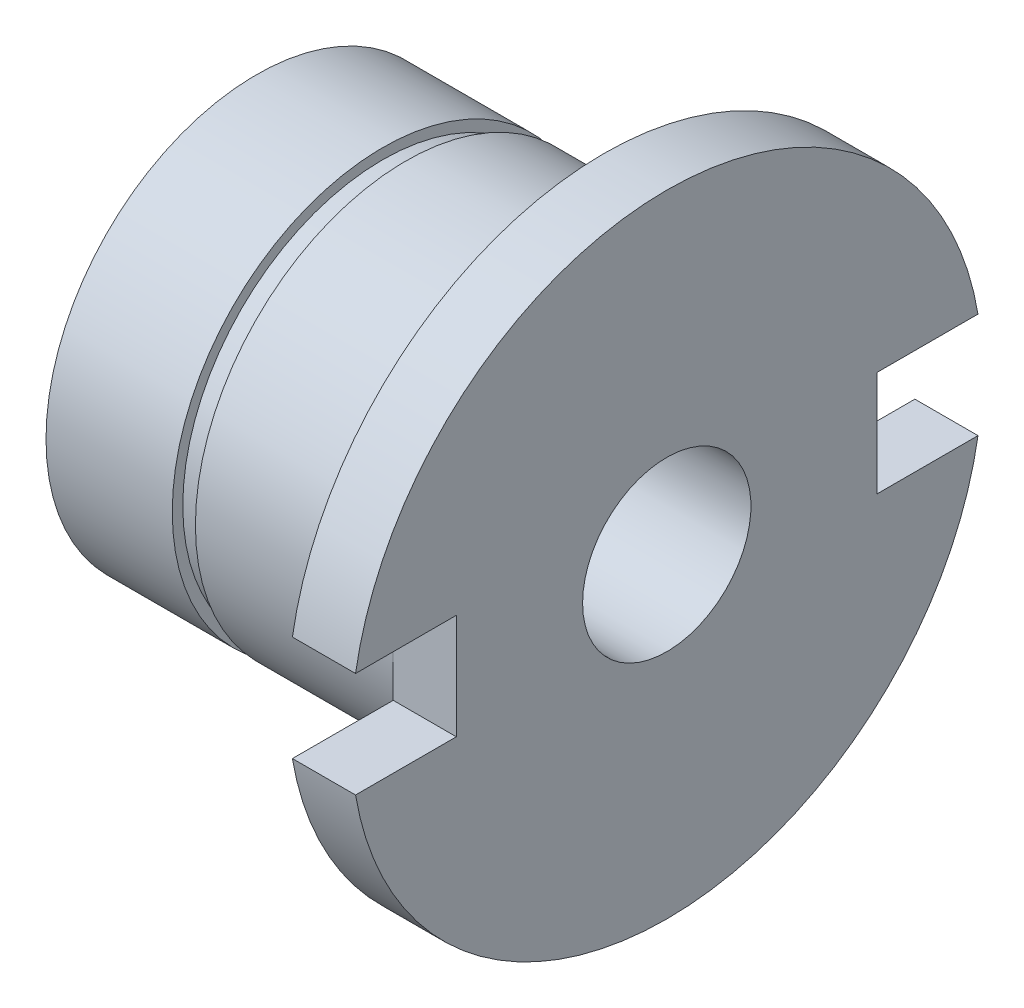
ISO-10303-21;
HEADER;
FILE_DESCRIPTION(('STEP AP214'),'2;1');
FILE_NAME('part.step','',(''),(''),'','','');
FILE_SCHEMA(('AUTOMOTIVE_DESIGN { 1 0 10303 214 1 1 1 1 }'));
ENDSEC;
DATA;
#1=APPLICATION_CONTEXT('core data for automotive mechanical design processes');
#2=APPLICATION_PROTOCOL_DEFINITION('international standard','automotive_design',2000,#1);
#3=PRODUCT_CONTEXT('',#1,'mechanical');
#4=PRODUCT('Part','Part','',(#3));
#5=PRODUCT_RELATED_PRODUCT_CATEGORY('part','',(#4));
#6=PRODUCT_DEFINITION_FORMATION('','',#4);
#7=PRODUCT_DEFINITION_CONTEXT('part definition',#1,'design');
#8=PRODUCT_DEFINITION('design','',#6,#7);
#9=PRODUCT_DEFINITION_SHAPE('','',#8);
#10=(LENGTH_UNIT() NAMED_UNIT(*) SI_UNIT(.MILLI.,.METRE.));
#11=(NAMED_UNIT(*) PLANE_ANGLE_UNIT() SI_UNIT($,.RADIAN.));
#12=(NAMED_UNIT(*) SI_UNIT($,.STERADIAN.) SOLID_ANGLE_UNIT());
#13=UNCERTAINTY_MEASURE_WITH_UNIT(LENGTH_MEASURE(1.E-05),#10,'distance_accuracy_value','');
#14=(GEOMETRIC_REPRESENTATION_CONTEXT(3) GLOBAL_UNCERTAINTY_ASSIGNED_CONTEXT((#13)) GLOBAL_UNIT_ASSIGNED_CONTEXT((#10,
#11,#12)) REPRESENTATION_CONTEXT('',''));
#15=CARTESIAN_POINT('',(0.,0.,0.));
#16=DIRECTION('',(0.,0.,1.));
#17=DIRECTION('',(1.,0.,0.));
#18=AXIS2_PLACEMENT_3D('',#15,#16,#17);
#19=CARTESIAN_POINT('',(0.,0.,0.));
#20=DIRECTION('',(-1.,0.,0.));
#21=DIRECTION('',(0.,0.,1.));
#22=AXIS2_PLACEMENT_3D('',#19,#20,#21);
#23=CYLINDRICAL_SURFACE('',#22,9.5);
#24=CARTESIAN_POINT('',(6.,0.,0.));
#25=DIRECTION('',(-1.,0.,0.));
#26=DIRECTION('',(0.,0.,1.));
#27=AXIS2_PLACEMENT_3D('',#24,#25,#26);
#28=CIRCLE('',#27,9.5);
#29=CARTESIAN_POINT('',(6.,0.,9.5));
#30=VERTEX_POINT('',#29);
#31=EDGE_CURVE('E20',#30,#30,#28,.F.);
#32=ORIENTED_EDGE('',*,*,#31,.T.);
#33=EDGE_LOOP('',(#32));
#34=FACE_BOUND('',#33,.T.);
#35=CARTESIAN_POINT('',(7.1,0.,0.));
#36=DIRECTION('',(-1.,0.,0.));
#37=DIRECTION('',(0.,0.,1.));
#38=AXIS2_PLACEMENT_3D('',#35,#36,#37);
#39=CIRCLE('',#38,9.5);
#40=CARTESIAN_POINT('',(7.1,0.,9.5));
#41=VERTEX_POINT('',#40);
#42=EDGE_CURVE('E205',#41,#41,#39,.T.);
#43=ORIENTED_EDGE('',*,*,#42,.T.);
#44=EDGE_LOOP('',(#43));
#45=FACE_BOUND('',#44,.T.);
#46=ADVANCED_FACE('F17',(#34,#45),#23,.T.);
#47=CARTESIAN_POINT('',(6.,9.5,0.));
#48=DIRECTION('',(-1.,0.,0.));
#49=DIRECTION('',(0.,0.,1.));
#50=AXIS2_PLACEMENT_3D('',#47,#48,#49);
#51=PLANE('',#50);
#52=ORIENTED_EDGE('',*,*,#31,.F.);
#53=EDGE_LOOP('',(#52));
#54=FACE_BOUND('',#53,.T.);
#55=CARTESIAN_POINT('',(6.,0.,0.));
#56=DIRECTION('',(-1.,0.,0.));
#57=DIRECTION('',(0.,0.,1.));
#58=AXIS2_PLACEMENT_3D('',#55,#56,#57);
#59=CIRCLE('',#58,10.);
#60=CARTESIAN_POINT('',(6.,0.,10.));
#61=VERTEX_POINT('',#60);
#62=EDGE_CURVE('E201',#61,#61,#59,.T.);
#63=ORIENTED_EDGE('',*,*,#62,.F.);
#64=EDGE_LOOP('',(#63));
#65=FACE_BOUND('',#64,.T.);
#66=ADVANCED_FACE('F188',(#54,#65),#51,.F.);
#67=CARTESIAN_POINT('',(7.1,10.,0.));
#68=DIRECTION('',(1.,0.,0.));
#69=DIRECTION('',(0.,0.,-1.));
#70=AXIS2_PLACEMENT_3D('',#67,#68,#69);
#71=PLANE('',#70);
#72=CARTESIAN_POINT('',(7.1,0.,0.));
#73=DIRECTION('',(-1.,0.,0.));
#74=DIRECTION('',(0.,0.,1.));
#75=AXIS2_PLACEMENT_3D('',#72,#73,#74);
#76=CIRCLE('',#75,10.);
#77=CARTESIAN_POINT('',(7.1,0.,10.));
#78=VERTEX_POINT('',#77);
#79=EDGE_CURVE('E204',#78,#78,#76,.F.);
#80=ORIENTED_EDGE('',*,*,#79,.F.);
#81=EDGE_LOOP('',(#80));
#82=FACE_BOUND('',#81,.T.);
#83=ORIENTED_EDGE('',*,*,#42,.F.);
#84=EDGE_LOOP('',(#83));
#85=FACE_BOUND('',#84,.T.);
#86=ADVANCED_FACE('F185',(#82,#85),#71,.F.);
#87=CARTESIAN_POINT('',(0.,0.,0.));
#88=DIRECTION('',(-1.,0.,0.));
#89=DIRECTION('',(0.,0.,1.));
#90=AXIS2_PLACEMENT_3D('',#87,#88,#89);
#91=CYLINDRICAL_SURFACE('',#90,10.);
#92=CARTESIAN_POINT('',(0.,0.,0.));
#93=DIRECTION('',(-1.,0.,0.));
#94=DIRECTION('',(0.,0.,1.));
#95=AXIS2_PLACEMENT_3D('',#92,#93,#94);
#96=CIRCLE('',#95,10.);
#97=CARTESIAN_POINT('',(0.,0.,10.));
#98=VERTEX_POINT('',#97);
#99=EDGE_CURVE('E212',#98,#98,#96,.F.);
#100=ORIENTED_EDGE('',*,*,#99,.T.);
#101=EDGE_LOOP('',(#100));
#102=FACE_BOUND('',#101,.T.);
#103=ORIENTED_EDGE('',*,*,#62,.T.);
#104=EDGE_LOOP('',(#103));
#105=FACE_BOUND('',#104,.T.);
#106=ADVANCED_FACE('F181',(#102,#105),#91,.T.);
#107=CARTESIAN_POINT('',(0.,0.,0.));
#108=DIRECTION('',(-1.,0.,0.));
#109=DIRECTION('',(0.,0.,1.));
#110=AXIS2_PLACEMENT_3D('',#107,#108,#109);
#111=CYLINDRICAL_SURFACE('',#110,10.);
#112=CARTESIAN_POINT('',(16.5,0.,0.));
#113=DIRECTION('',(-1.,0.,0.));
#114=DIRECTION('',(0.,0.,1.));
#115=AXIS2_PLACEMENT_3D('',#112,#113,#114);
#116=CIRCLE('',#115,10.);
#117=CARTESIAN_POINT('',(16.5,0.,10.));
#118=VERTEX_POINT('',#117);
#119=CARTESIAN_POINT('',(16.5,0.,-10.));
#120=VERTEX_POINT('',#119);
#121=EDGE_CURVE('E77',#118,#120,#116,.T.);
#122=ORIENTED_EDGE('',*,*,#121,.T.);
#123=CARTESIAN_POINT('',(16.5,0.,0.));
#124=DIRECTION('',(-1.,0.,0.));
#125=DIRECTION('',(0.,0.,1.));
#126=AXIS2_PLACEMENT_3D('',#123,#124,#125);
#127=CIRCLE('',#126,10.);
#128=EDGE_CURVE('E222',#120,#118,#127,.T.);
#129=ORIENTED_EDGE('',*,*,#128,.T.);
#130=EDGE_LOOP('',(#122,#129));
#131=FACE_BOUND('',#130,.T.);
#132=ORIENTED_EDGE('',*,*,#79,.T.);
#133=EDGE_LOOP('',(#132));
#134=FACE_BOUND('',#133,.T.);
#135=ADVANCED_FACE('F177',(#131,#134),#111,.T.);
#136=CARTESIAN_POINT('',(0.,4.,0.));
#137=DIRECTION('',(1.,0.,0.));
#138=DIRECTION('',(0.,0.,-1.));
#139=AXIS2_PLACEMENT_3D('',#136,#137,#138);
#140=PLANE('',#139);
#141=ORIENTED_EDGE('',*,*,#99,.F.);
#142=EDGE_LOOP('',(#141));
#143=FACE_BOUND('',#142,.T.);
#144=CARTESIAN_POINT('',(0.,0.,0.));
#145=DIRECTION('',(-1.,0.,0.));
#146=DIRECTION('',(0.,0.,1.));
#147=AXIS2_PLACEMENT_3D('',#144,#145,#146);
#148=CIRCLE('',#147,4.);
#149=CARTESIAN_POINT('',(0.,0.,4.));
#150=VERTEX_POINT('',#149);
#151=EDGE_CURVE('E226',#150,#150,#148,.F.);
#152=ORIENTED_EDGE('',*,*,#151,.T.);
#153=EDGE_LOOP('',(#152));
#154=FACE_BOUND('',#153,.T.);
#155=ADVANCED_FACE('F174',(#143,#154),#140,.F.);
#156=CARTESIAN_POINT('',(16.5,10.,0.));
#157=DIRECTION('',(1.,0.,0.));
#158=DIRECTION('',(0.,0.,-1.));
#159=AXIS2_PLACEMENT_3D('',#156,#157,#158);
#160=PLANE('',#159);
#161=CARTESIAN_POINT('',(16.5,0.,0.));
#162=DIRECTION('',(-1.,0.,0.));
#163=DIRECTION('',(0.,0.,1.));
#164=AXIS2_PLACEMENT_3D('',#161,#162,#163);
#165=CIRCLE('',#164,15.);
#166=CARTESIAN_POINT('',(16.5,2.5,-14.790199457749));
#167=VERTEX_POINT('',#166);
#168=CARTESIAN_POINT('',(16.5,2.5,14.790199457749));
#169=VERTEX_POINT('',#168);
#170=EDGE_CURVE('E230',#167,#169,#165,.F.);
#171=ORIENTED_EDGE('',*,*,#170,.F.);
#172=DIRECTION('',(0.,0.,-1.));
#173=VECTOR('',#172,1.);
#174=CARTESIAN_POINT('',(16.5,2.5,-10.));
#175=LINE('',#174,#173);
#176=CARTESIAN_POINT('',(16.5,2.5,-10.));
#177=VERTEX_POINT('',#176);
#178=EDGE_CURVE('E234',#177,#167,#175,.T.);
#179=ORIENTED_EDGE('',*,*,#178,.F.);
#180=DIRECTION('',(0.,1.,0.));
#181=VECTOR('',#180,1.);
#182=CARTESIAN_POINT('',(16.5,-2.5,-10.));
#183=LINE('',#182,#181);
#184=EDGE_CURVE('E262',#120,#177,#183,.T.);
#185=ORIENTED_EDGE('',*,*,#184,.F.);
#186=ORIENTED_EDGE('',*,*,#121,.F.);
#187=DIRECTION('',(0.,1.,0.));
#188=VECTOR('',#187,1.);
#189=CARTESIAN_POINT('',(16.5,2.5,10.));
#190=LINE('',#189,#188);
#191=CARTESIAN_POINT('',(16.5,2.5,10.));
#192=VERTEX_POINT('',#191);
#193=EDGE_CURVE('E229',#192,#118,#190,.F.);
#194=ORIENTED_EDGE('',*,*,#193,.F.);
#195=DIRECTION('',(0.,0.,-1.));
#196=VECTOR('',#195,1.);
#197=CARTESIAN_POINT('',(16.5,2.5,10.));
#198=LINE('',#197,#196);
#199=EDGE_CURVE('E84',#169,#192,#198,.T.);
#200=ORIENTED_EDGE('',*,*,#199,.F.);
#201=EDGE_LOOP('',(#171,#179,#185,#186,#194,#200));
#202=FACE_BOUND('',#201,.T.);
#203=ADVANCED_FACE('F170',(#202),#160,.F.);
#204=CARTESIAN_POINT('',(16.5,10.,0.));
#205=DIRECTION('',(1.,0.,0.));
#206=DIRECTION('',(0.,0.,-1.));
#207=AXIS2_PLACEMENT_3D('',#204,#205,#206);
#208=PLANE('',#207);
#209=DIRECTION('',(0.,1.,0.));
#210=VECTOR('',#209,1.);
#211=CARTESIAN_POINT('',(16.5,2.5,10.));
#212=LINE('',#211,#210);
#213=CARTESIAN_POINT('',(16.5,-2.5,10.));
#214=VERTEX_POINT('',#213);
#215=EDGE_CURVE('E124',#118,#214,#212,.F.);
#216=ORIENTED_EDGE('',*,*,#215,.F.);
#217=ORIENTED_EDGE('',*,*,#128,.F.);
#218=DIRECTION('',(0.,1.,0.));
#219=VECTOR('',#218,1.);
#220=CARTESIAN_POINT('',(16.5,-2.5,-10.));
#221=LINE('',#220,#219);
#222=CARTESIAN_POINT('',(16.5,-2.5,-10.));
#223=VERTEX_POINT('',#222);
#224=EDGE_CURVE('E266',#223,#120,#221,.T.);
#225=ORIENTED_EDGE('',*,*,#224,.F.);
#226=DIRECTION('',(0.,0.,1.));
#227=VECTOR('',#226,1.);
#228=CARTESIAN_POINT('',(16.5,-2.5,-10.));
#229=LINE('',#228,#227);
#230=CARTESIAN_POINT('',(16.5,-2.5,-14.790199457749));
#231=VERTEX_POINT('',#230);
#232=EDGE_CURVE('E279',#231,#223,#229,.T.);
#233=ORIENTED_EDGE('',*,*,#232,.F.);
#234=CARTESIAN_POINT('',(16.5,0.,0.));
#235=DIRECTION('',(-1.,0.,0.));
#236=DIRECTION('',(0.,0.,1.));
#237=AXIS2_PLACEMENT_3D('',#234,#235,#236);
#238=CIRCLE('',#237,15.);
#239=CARTESIAN_POINT('',(16.5,-2.5,14.790199457749));
#240=VERTEX_POINT('',#239);
#241=EDGE_CURVE('E236',#240,#231,#238,.F.);
#242=ORIENTED_EDGE('',*,*,#241,.F.);
#243=DIRECTION('',(0.,0.,1.));
#244=VECTOR('',#243,1.);
#245=CARTESIAN_POINT('',(16.5,-2.5,10.));
#246=LINE('',#245,#244);
#247=EDGE_CURVE('E126',#214,#240,#246,.T.);
#248=ORIENTED_EDGE('',*,*,#247,.F.);
#249=EDGE_LOOP('',(#216,#217,#225,#233,#242,#248));
#250=FACE_BOUND('',#249,.T.);
#251=ADVANCED_FACE('F166',(#250),#208,.F.);
#252=CARTESIAN_POINT('',(0.,0.,0.));
#253=DIRECTION('',(-1.,0.,0.));
#254=DIRECTION('',(0.,0.,1.));
#255=AXIS2_PLACEMENT_3D('',#252,#253,#254);
#256=CYLINDRICAL_SURFACE('',#255,4.);
#257=CARTESIAN_POINT('',(19.5,0.,0.));
#258=DIRECTION('',(-1.,0.,0.));
#259=DIRECTION('',(0.,0.,1.));
#260=AXIS2_PLACEMENT_3D('',#257,#258,#259);
#261=CIRCLE('',#260,4.);
#262=CARTESIAN_POINT('',(19.5,0.,4.));
#263=VERTEX_POINT('',#262);
#264=EDGE_CURVE('E118',#263,#263,#261,.F.);
#265=ORIENTED_EDGE('',*,*,#264,.T.);
#266=EDGE_LOOP('',(#265));
#267=FACE_BOUND('',#266,.T.);
#268=ORIENTED_EDGE('',*,*,#151,.F.);
#269=EDGE_LOOP('',(#268));
#270=FACE_BOUND('',#269,.T.);
#271=ADVANCED_FACE('F163',(#267,#270),#256,.F.);
#272=CARTESIAN_POINT('',(81.6164340610252,2.5,10.));
#273=DIRECTION('',(0.,0.,1.));
#274=DIRECTION('',(1.,0.,0.));
#275=AXIS2_PLACEMENT_3D('',#272,#273,#274);
#276=PLANE('',#275);
#277=DIRECTION('',(1.,0.,0.));
#278=VECTOR('',#277,1.);
#279=CARTESIAN_POINT('',(81.6164340610252,-2.5,10.));
#280=LINE('',#279,#278);
#281=CARTESIAN_POINT('',(19.5,-2.5,10.));
#282=VERTEX_POINT('',#281);
#283=EDGE_CURVE('E121',#282,#214,#280,.F.);
#284=ORIENTED_EDGE('',*,*,#283,.F.);
#285=DIRECTION('',(0.,1.,0.));
#286=VECTOR('',#285,1.);
#287=CARTESIAN_POINT('',(19.5,4.,10.));
#288=LINE('',#287,#286);
#289=CARTESIAN_POINT('',(19.5,2.5,10.));
#290=VERTEX_POINT('',#289);
#291=EDGE_CURVE('E106',#282,#290,#288,.T.);
#292=ORIENTED_EDGE('',*,*,#291,.T.);
#293=DIRECTION('',(1.,0.,0.));
#294=VECTOR('',#293,1.);
#295=CARTESIAN_POINT('',(81.6164340610252,2.5,10.));
#296=LINE('',#295,#294);
#297=EDGE_CURVE('E259',#192,#290,#296,.T.);
#298=ORIENTED_EDGE('',*,*,#297,.F.);
#299=ORIENTED_EDGE('',*,*,#193,.T.);
#300=ORIENTED_EDGE('',*,*,#215,.T.);
#301=EDGE_LOOP('',(#284,#292,#298,#299,#300));
#302=FACE_BOUND('',#301,.T.);
#303=ADVANCED_FACE('F122',(#302),#276,.T.);
#304=CARTESIAN_POINT('',(81.6164340610252,2.5,10.));
#305=DIRECTION('',(0.,-1.,0.));
#306=DIRECTION('',(0.,0.,-1.));
#307=AXIS2_PLACEMENT_3D('',#304,#305,#306);
#308=PLANE('',#307);
#309=ORIENTED_EDGE('',*,*,#297,.T.);
#310=DIRECTION('',(0.,0.,1.));
#311=VECTOR('',#310,1.);
#312=CARTESIAN_POINT('',(19.5,2.5,0.));
#313=LINE('',#312,#311);
#314=CARTESIAN_POINT('',(19.5,2.5,14.790199457749));
#315=VERTEX_POINT('',#314);
#316=EDGE_CURVE('E114',#290,#315,#313,.T.);
#317=ORIENTED_EDGE('',*,*,#316,.T.);
#318=DIRECTION('',(-1.,0.,0.));
#319=VECTOR('',#318,1.);
#320=CARTESIAN_POINT('',(0.,2.5,14.790199457749));
#321=LINE('',#320,#319);
#322=EDGE_CURVE('E235',#169,#315,#321,.F.);
#323=ORIENTED_EDGE('',*,*,#322,.F.);
#324=ORIENTED_EDGE('',*,*,#199,.T.);
#325=EDGE_LOOP('',(#309,#317,#323,#324));
#326=FACE_BOUND('',#325,.T.);
#327=ADVANCED_FACE('F157',(#326),#308,.T.);
#328=CARTESIAN_POINT('',(0.,0.,0.));
#329=DIRECTION('',(-1.,0.,0.));
#330=DIRECTION('',(0.,0.,1.));
#331=AXIS2_PLACEMENT_3D('',#328,#329,#330);
#332=CYLINDRICAL_SURFACE('',#331,15.);
#333=DIRECTION('',(1.,0.,0.));
#334=VECTOR('',#333,1.);
#335=CARTESIAN_POINT('',(81.6164340610252,2.5,-14.790199457749));
#336=LINE('',#335,#334);
#337=CARTESIAN_POINT('',(19.5,2.5,-14.790199457749));
#338=VERTEX_POINT('',#337);
#339=EDGE_CURVE('E271',#167,#338,#336,.T.);
#340=ORIENTED_EDGE('',*,*,#339,.F.);
#341=ORIENTED_EDGE('',*,*,#170,.T.);
#342=ORIENTED_EDGE('',*,*,#322,.T.);
#343=CARTESIAN_POINT('',(19.5,0.,0.));
#344=DIRECTION('',(-1.,0.,0.));
#345=DIRECTION('',(0.,0.,1.));
#346=AXIS2_PLACEMENT_3D('',#343,#344,#345);
#347=CIRCLE('',#346,15.);
#348=EDGE_CURVE('E243',#315,#338,#347,.T.);
#349=ORIENTED_EDGE('',*,*,#348,.T.);
#350=EDGE_LOOP('',(#340,#341,#342,#349));
#351=FACE_BOUND('',#350,.T.);
#352=ADVANCED_FACE('F153',(#351),#332,.T.);
#353=CARTESIAN_POINT('',(81.6164340610252,2.5,-10.));
#354=DIRECTION('',(0.,-1.,0.));
#355=DIRECTION('',(0.,0.,-1.));
#356=AXIS2_PLACEMENT_3D('',#353,#354,#355);
#357=PLANE('',#356);
#358=ORIENTED_EDGE('',*,*,#339,.T.);
#359=DIRECTION('',(0.,0.,1.));
#360=VECTOR('',#359,1.);
#361=CARTESIAN_POINT('',(19.5,2.5,0.));
#362=LINE('',#361,#360);
#363=CARTESIAN_POINT('',(19.5,2.5,-10.));
#364=VERTEX_POINT('',#363);
#365=EDGE_CURVE('E247',#338,#364,#362,.T.);
#366=ORIENTED_EDGE('',*,*,#365,.T.);
#367=DIRECTION('',(-1.,0.,0.));
#368=VECTOR('',#367,1.);
#369=CARTESIAN_POINT('',(81.6164340610252,2.5,-10.));
#370=LINE('',#369,#368);
#371=EDGE_CURVE('E265',#177,#364,#370,.F.);
#372=ORIENTED_EDGE('',*,*,#371,.F.);
#373=ORIENTED_EDGE('',*,*,#178,.T.);
#374=EDGE_LOOP('',(#358,#366,#372,#373));
#375=FACE_BOUND('',#374,.T.);
#376=ADVANCED_FACE('F149',(#375),#357,.T.);
#377=CARTESIAN_POINT('',(81.6164340610252,-2.5,-10.));
#378=DIRECTION('',(0.,0.,-1.));
#379=DIRECTION('',(-1.,0.,0.));
#380=AXIS2_PLACEMENT_3D('',#377,#378,#379);
#381=PLANE('',#380);
#382=ORIENTED_EDGE('',*,*,#371,.T.);
#383=DIRECTION('',(0.,1.,0.));
#384=VECTOR('',#383,1.);
#385=CARTESIAN_POINT('',(19.5,4.,-10.));
#386=LINE('',#385,#384);
#387=CARTESIAN_POINT('',(19.5,-2.5,-10.));
#388=VERTEX_POINT('',#387);
#389=EDGE_CURVE('E303',#364,#388,#386,.F.);
#390=ORIENTED_EDGE('',*,*,#389,.T.);
#391=DIRECTION('',(1.,0.,0.));
#392=VECTOR('',#391,1.);
#393=CARTESIAN_POINT('',(81.6164340610252,-2.5,-10.));
#394=LINE('',#393,#392);
#395=EDGE_CURVE('E239',#223,#388,#394,.T.);
#396=ORIENTED_EDGE('',*,*,#395,.F.);
#397=ORIENTED_EDGE('',*,*,#224,.T.);
#398=ORIENTED_EDGE('',*,*,#184,.T.);
#399=EDGE_LOOP('',(#382,#390,#396,#397,#398));
#400=FACE_BOUND('',#399,.T.);
#401=ADVANCED_FACE('F145',(#400),#381,.T.);
#402=CARTESIAN_POINT('',(81.6164340610252,-2.5,-10.));
#403=DIRECTION('',(0.,1.,0.));
#404=DIRECTION('',(0.,0.,1.));
#405=AXIS2_PLACEMENT_3D('',#402,#403,#404);
#406=PLANE('',#405);
#407=ORIENTED_EDGE('',*,*,#395,.T.);
#408=DIRECTION('',(0.,0.,1.));
#409=VECTOR('',#408,1.);
#410=CARTESIAN_POINT('',(19.5,-2.5,0.));
#411=LINE('',#410,#409);
#412=CARTESIAN_POINT('',(19.5,-2.5,-14.790199457749));
#413=VERTEX_POINT('',#412);
#414=EDGE_CURVE('E250',#388,#413,#411,.F.);
#415=ORIENTED_EDGE('',*,*,#414,.T.);
#416=DIRECTION('',(-1.,0.,0.));
#417=VECTOR('',#416,1.);
#418=CARTESIAN_POINT('',(0.,-2.5,-14.790199457749));
#419=LINE('',#418,#417);
#420=EDGE_CURVE('E127',#231,#413,#419,.F.);
#421=ORIENTED_EDGE('',*,*,#420,.F.);
#422=ORIENTED_EDGE('',*,*,#232,.T.);
#423=EDGE_LOOP('',(#407,#415,#421,#422));
#424=FACE_BOUND('',#423,.T.);
#425=ADVANCED_FACE('F139',(#424),#406,.T.);
#426=CARTESIAN_POINT('',(0.,0.,0.));
#427=DIRECTION('',(-1.,0.,0.));
#428=DIRECTION('',(0.,0.,1.));
#429=AXIS2_PLACEMENT_3D('',#426,#427,#428);
#430=CYLINDRICAL_SURFACE('',#429,15.);
#431=ORIENTED_EDGE('',*,*,#420,.T.);
#432=CARTESIAN_POINT('',(19.5,0.,0.));
#433=DIRECTION('',(-1.,0.,0.));
#434=DIRECTION('',(0.,0.,1.));
#435=AXIS2_PLACEMENT_3D('',#432,#433,#434);
#436=CIRCLE('',#435,15.);
#437=CARTESIAN_POINT('',(19.5,-2.5,14.790199457749));
#438=VERTEX_POINT('',#437);
#439=EDGE_CURVE('E26',#413,#438,#436,.T.);
#440=ORIENTED_EDGE('',*,*,#439,.T.);
#441=DIRECTION('',(1.,0.,0.));
#442=VECTOR('',#441,1.);
#443=CARTESIAN_POINT('',(81.6164340610252,-2.5,14.790199457749));
#444=LINE('',#443,#442);
#445=EDGE_CURVE('E34',#240,#438,#444,.T.);
#446=ORIENTED_EDGE('',*,*,#445,.F.);
#447=ORIENTED_EDGE('',*,*,#241,.T.);
#448=EDGE_LOOP('',(#431,#440,#446,#447));
#449=FACE_BOUND('',#448,.T.);
#450=ADVANCED_FACE('F131',(#449),#430,.T.);
#451=CARTESIAN_POINT('',(81.6164340610252,-2.5,10.));
#452=DIRECTION('',(0.,1.,0.));
#453=DIRECTION('',(0.,0.,1.));
#454=AXIS2_PLACEMENT_3D('',#451,#452,#453);
#455=PLANE('',#454);
#456=ORIENTED_EDGE('',*,*,#445,.T.);
#457=DIRECTION('',(0.,0.,1.));
#458=VECTOR('',#457,1.);
#459=CARTESIAN_POINT('',(19.5,-2.5,0.));
#460=LINE('',#459,#458);
#461=EDGE_CURVE('E11',#438,#282,#460,.F.);
#462=ORIENTED_EDGE('',*,*,#461,.T.);
#463=ORIENTED_EDGE('',*,*,#283,.T.);
#464=ORIENTED_EDGE('',*,*,#247,.T.);
#465=EDGE_LOOP('',(#456,#462,#463,#464));
#466=FACE_BOUND('',#465,.T.);
#467=ADVANCED_FACE('F129',(#466),#455,.T.);
#468=CARTESIAN_POINT('',(19.5,4.,0.));
#469=DIRECTION('',(-1.,0.,0.));
#470=DIRECTION('',(0.,0.,1.));
#471=AXIS2_PLACEMENT_3D('',#468,#469,#470);
#472=PLANE('',#471);
#473=ORIENTED_EDGE('',*,*,#439,.F.);
#474=ORIENTED_EDGE('',*,*,#414,.F.);
#475=ORIENTED_EDGE('',*,*,#389,.F.);
#476=ORIENTED_EDGE('',*,*,#365,.F.);
#477=ORIENTED_EDGE('',*,*,#348,.F.);
#478=ORIENTED_EDGE('',*,*,#316,.F.);
#479=ORIENTED_EDGE('',*,*,#291,.F.);
#480=ORIENTED_EDGE('',*,*,#461,.F.);
#481=EDGE_LOOP('',(#473,#474,#475,#476,#477,#478,#479,#480));
#482=FACE_BOUND('',#481,.T.);
#483=ORIENTED_EDGE('',*,*,#264,.F.);
#484=EDGE_LOOP('',(#483));
#485=FACE_BOUND('',#484,.T.);
#486=ADVANCED_FACE('F109',(#482,#485),#472,.F.);
#487=CLOSED_SHELL('',(#46,#66,#86,#106,#135,#155,#203,#251,#271,#303,#327,#352,#376,#401,#425,
#450,#467,#486));
#488=MANIFOLD_SOLID_BREP('B1',#487);
#489=ADVANCED_BREP_SHAPE_REPRESENTATION('',(#18,#488),#14);
#490=SHAPE_DEFINITION_REPRESENTATION(#9,#489);
ENDSEC;
END-ISO-10303-21;
